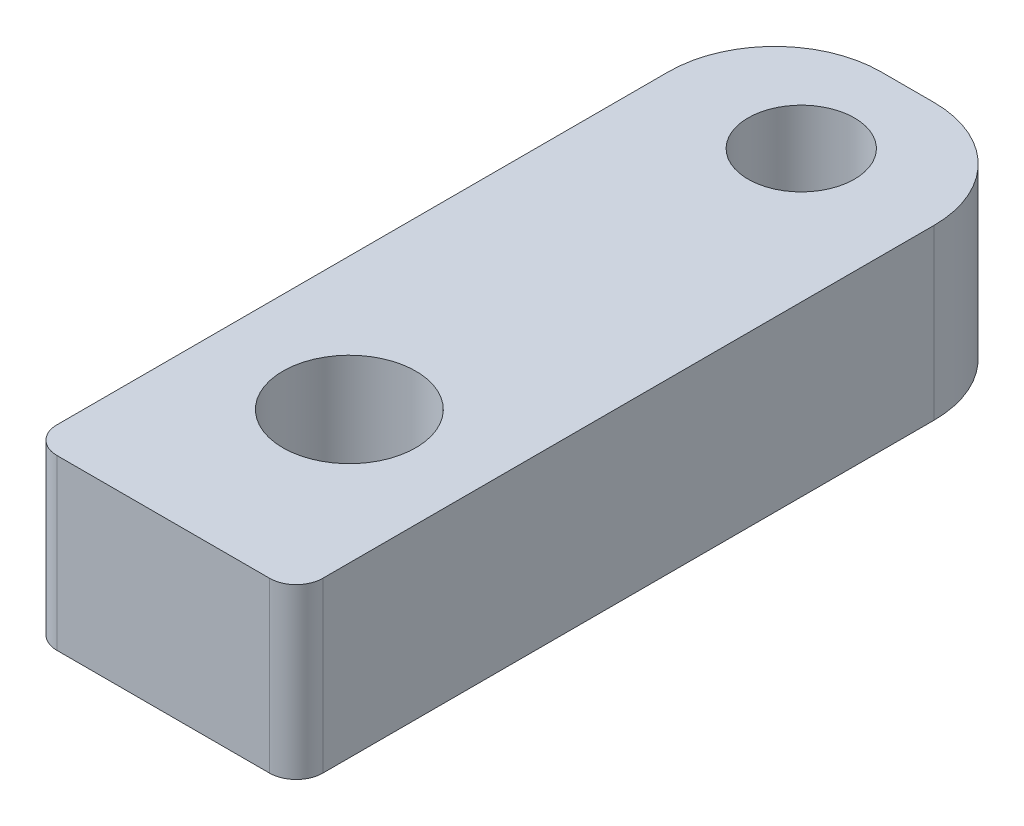
ISO-10303-21;
HEADER;
FILE_DESCRIPTION(('STEP AP214'),'2;1');
FILE_NAME('part.step','',(''),(''),'','','');
FILE_SCHEMA(('AUTOMOTIVE_DESIGN { 1 0 10303 214 1 1 1 1 }'));
ENDSEC;
DATA;
#1=APPLICATION_CONTEXT('core data for automotive mechanical design processes');
#2=APPLICATION_PROTOCOL_DEFINITION('international standard','automotive_design',2000,#1);
#3=PRODUCT_CONTEXT('',#1,'mechanical');
#4=PRODUCT('Part','Part','',(#3));
#5=PRODUCT_RELATED_PRODUCT_CATEGORY('part','',(#4));
#6=PRODUCT_DEFINITION_FORMATION('','',#4);
#7=PRODUCT_DEFINITION_CONTEXT('part definition',#1,'design');
#8=PRODUCT_DEFINITION('design','',#6,#7);
#9=PRODUCT_DEFINITION_SHAPE('','',#8);
#10=(LENGTH_UNIT() NAMED_UNIT(*) SI_UNIT(.MILLI.,.METRE.));
#11=(NAMED_UNIT(*) PLANE_ANGLE_UNIT() SI_UNIT($,.RADIAN.));
#12=(NAMED_UNIT(*) SI_UNIT($,.STERADIAN.) SOLID_ANGLE_UNIT());
#13=UNCERTAINTY_MEASURE_WITH_UNIT(LENGTH_MEASURE(1.E-05),#10,'distance_accuracy_value','');
#14=(GEOMETRIC_REPRESENTATION_CONTEXT(3) GLOBAL_UNCERTAINTY_ASSIGNED_CONTEXT((#13)) GLOBAL_UNIT_ASSIGNED_CONTEXT((#10,
#11,#12)) REPRESENTATION_CONTEXT('',''));
#15=CARTESIAN_POINT('',(0.,0.,0.));
#16=DIRECTION('',(0.,0.,1.));
#17=DIRECTION('',(1.,0.,0.));
#18=AXIS2_PLACEMENT_3D('',#15,#16,#17);
#19=CARTESIAN_POINT('',(2.5,-3.175,7.));
#20=DIRECTION('',(1.,0.,0.));
#21=DIRECTION('',(0.,0.,-1.));
#22=AXIS2_PLACEMENT_3D('',#19,#20,#21);
#23=PLANE('',#22);
#24=DIRECTION('',(0.,0.,-1.));
#25=VECTOR('',#24,1.);
#26=CARTESIAN_POINT('',(2.5,0.,7.));
#27=LINE('',#26,#25);
#28=CARTESIAN_POINT('',(2.5,0.,6.5));
#29=VERTEX_POINT('',#28);
#30=CARTESIAN_POINT('',(2.5,0.,-5.));
#31=VERTEX_POINT('',#30);
#32=EDGE_CURVE('E118',#29,#31,#27,.T.);
#33=ORIENTED_EDGE('',*,*,#32,.F.);
#34=DIRECTION('',(0.,1.,0.));
#35=VECTOR('',#34,1.);
#36=CARTESIAN_POINT('',(2.5,-3.175,6.5));
#37=LINE('',#36,#35);
#38=CARTESIAN_POINT('',(2.5,-3.175,6.5));
#39=VERTEX_POINT('',#38);
#40=EDGE_CURVE('E11',#29,#39,#37,.F.);
#41=ORIENTED_EDGE('',*,*,#40,.T.);
#42=DIRECTION('',(0.,0.,-1.));
#43=VECTOR('',#42,1.);
#44=CARTESIAN_POINT('',(2.5,-3.175,7.));
#45=LINE('',#44,#43);
#46=CARTESIAN_POINT('',(2.5,-3.175,-5.));
#47=VERTEX_POINT('',#46);
#48=EDGE_CURVE('E207',#39,#47,#45,.T.);
#49=ORIENTED_EDGE('',*,*,#48,.T.);
#50=DIRECTION('',(0.,1.,0.));
#51=VECTOR('',#50,1.);
#52=CARTESIAN_POINT('',(2.5,-3.175,-5.));
#53=LINE('',#52,#51);
#54=EDGE_CURVE('E163',#47,#31,#53,.T.);
#55=ORIENTED_EDGE('',*,*,#54,.T.);
#56=EDGE_LOOP('',(#33,#41,#49,#55));
#57=FACE_BOUND('',#56,.T.);
#58=ADVANCED_FACE('F47',(#57),#23,.T.);
#59=CARTESIAN_POINT('',(-2.5,-3.175,7.));
#60=DIRECTION('',(0.,0.,1.));
#61=DIRECTION('',(1.,0.,0.));
#62=AXIS2_PLACEMENT_3D('',#59,#60,#61);
#63=PLANE('',#62);
#64=DIRECTION('',(1.,0.,0.));
#65=VECTOR('',#64,1.);
#66=CARTESIAN_POINT('',(-2.5,0.,7.));
#67=LINE('',#66,#65);
#68=CARTESIAN_POINT('',(-2.,0.,7.));
#69=VERTEX_POINT('',#68);
#70=CARTESIAN_POINT('',(2.,0.,7.));
#71=VERTEX_POINT('',#70);
#72=EDGE_CURVE('E150',#69,#71,#67,.T.);
#73=ORIENTED_EDGE('',*,*,#72,.F.);
#74=DIRECTION('',(0.,1.,0.));
#75=VECTOR('',#74,1.);
#76=CARTESIAN_POINT('',(-2.,-3.175,7.));
#77=LINE('',#76,#75);
#78=CARTESIAN_POINT('',(-2.,-3.175,7.));
#79=VERTEX_POINT('',#78);
#80=EDGE_CURVE('E180',#69,#79,#77,.F.);
#81=ORIENTED_EDGE('',*,*,#80,.T.);
#82=DIRECTION('',(1.,0.,0.));
#83=VECTOR('',#82,1.);
#84=CARTESIAN_POINT('',(-2.5,-3.175,7.));
#85=LINE('',#84,#83);
#86=CARTESIAN_POINT('',(2.,-3.175,7.));
#87=VERTEX_POINT('',#86);
#88=EDGE_CURVE('E142',#79,#87,#85,.T.);
#89=ORIENTED_EDGE('',*,*,#88,.T.);
#90=DIRECTION('',(0.,1.,0.));
#91=VECTOR('',#90,1.);
#92=CARTESIAN_POINT('',(2.,-3.175,7.));
#93=LINE('',#92,#91);
#94=EDGE_CURVE('E176',#87,#71,#93,.T.);
#95=ORIENTED_EDGE('',*,*,#94,.T.);
#96=EDGE_LOOP('',(#73,#81,#89,#95));
#97=FACE_BOUND('',#96,.T.);
#98=ADVANCED_FACE('F204',(#97),#63,.T.);
#99=CARTESIAN_POINT('',(-2.5,-3.175,7.));
#100=DIRECTION('',(-1.,0.,0.));
#101=DIRECTION('',(0.,0.,1.));
#102=AXIS2_PLACEMENT_3D('',#99,#100,#101);
#103=PLANE('',#102);
#104=DIRECTION('',(0.,0.,1.));
#105=VECTOR('',#104,1.);
#106=CARTESIAN_POINT('',(-2.5,-3.175,7.));
#107=LINE('',#106,#105);
#108=CARTESIAN_POINT('',(-2.5,-3.175,-5.));
#109=VERTEX_POINT('',#108);
#110=CARTESIAN_POINT('',(-2.5,-3.175,6.5));
#111=VERTEX_POINT('',#110);
#112=EDGE_CURVE('E147',#109,#111,#107,.T.);
#113=ORIENTED_EDGE('',*,*,#112,.T.);
#114=DIRECTION('',(0.,1.,0.));
#115=VECTOR('',#114,1.);
#116=CARTESIAN_POINT('',(-2.5,-3.175,6.5));
#117=LINE('',#116,#115);
#118=CARTESIAN_POINT('',(-2.5,0.,6.5));
#119=VERTEX_POINT('',#118);
#120=EDGE_CURVE('E166',#111,#119,#117,.T.);
#121=ORIENTED_EDGE('',*,*,#120,.T.);
#122=DIRECTION('',(0.,0.,1.));
#123=VECTOR('',#122,1.);
#124=CARTESIAN_POINT('',(-2.5,0.,7.));
#125=LINE('',#124,#123);
#126=CARTESIAN_POINT('',(-2.5,0.,-5.));
#127=VERTEX_POINT('',#126);
#128=EDGE_CURVE('E135',#127,#119,#125,.T.);
#129=ORIENTED_EDGE('',*,*,#128,.F.);
#130=DIRECTION('',(0.,1.,0.));
#131=VECTOR('',#130,1.);
#132=CARTESIAN_POINT('',(-2.5,-3.175,-5.));
#133=LINE('',#132,#131);
#134=EDGE_CURVE('E155',#127,#109,#133,.F.);
#135=ORIENTED_EDGE('',*,*,#134,.T.);
#136=EDGE_LOOP('',(#113,#121,#129,#135));
#137=FACE_BOUND('',#136,.T.);
#138=ADVANCED_FACE('F194',(#137),#103,.T.);
#139=CARTESIAN_POINT('',(-2.5,-3.175,-7.));
#140=DIRECTION('',(0.,0.,-1.));
#141=DIRECTION('',(-1.,0.,0.));
#142=AXIS2_PLACEMENT_3D('',#139,#140,#141);
#143=PLANE('',#142);
#144=DIRECTION('',(-1.,0.,0.));
#145=VECTOR('',#144,1.);
#146=CARTESIAN_POINT('',(-2.5,-3.175,-7.));
#147=LINE('',#146,#145);
#148=CARTESIAN_POINT('',(0.5,-3.175,-7.));
#149=VERTEX_POINT('',#148);
#150=CARTESIAN_POINT('',(-0.5,-3.175,-7.));
#151=VERTEX_POINT('',#150);
#152=EDGE_CURVE('E198',#149,#151,#147,.T.);
#153=ORIENTED_EDGE('',*,*,#152,.T.);
#154=DIRECTION('',(0.,1.,0.));
#155=VECTOR('',#154,1.);
#156=CARTESIAN_POINT('',(-0.5,-3.175,-7.));
#157=LINE('',#156,#155);
#158=CARTESIAN_POINT('',(-0.5,0.,-7.));
#159=VERTEX_POINT('',#158);
#160=EDGE_CURVE('E125',#151,#159,#157,.T.);
#161=ORIENTED_EDGE('',*,*,#160,.T.);
#162=DIRECTION('',(-1.,0.,0.));
#163=VECTOR('',#162,1.);
#164=CARTESIAN_POINT('',(-2.5,0.,-7.));
#165=LINE('',#164,#163);
#166=CARTESIAN_POINT('',(0.5,0.,-7.));
#167=VERTEX_POINT('',#166);
#168=EDGE_CURVE('E117',#167,#159,#165,.T.);
#169=ORIENTED_EDGE('',*,*,#168,.F.);
#170=DIRECTION('',(0.,1.,0.));
#171=VECTOR('',#170,1.);
#172=CARTESIAN_POINT('',(0.5,-3.175,-7.));
#173=LINE('',#172,#171);
#174=EDGE_CURVE('E131',#167,#149,#173,.F.);
#175=ORIENTED_EDGE('',*,*,#174,.T.);
#176=EDGE_LOOP('',(#153,#161,#169,#175));
#177=FACE_BOUND('',#176,.T.);
#178=ADVANCED_FACE('F130',(#177),#143,.T.);
#179=CARTESIAN_POINT('',(0.,-3.175,0.));
#180=DIRECTION('',(0.,-1.,0.));
#181=DIRECTION('',(0.,0.,-1.));
#182=AXIS2_PLACEMENT_3D('',#179,#180,#181);
#183=PLANE('',#182);
#184=CARTESIAN_POINT('',(0.,-3.175,3.5));
#185=DIRECTION('',(0.,1.,0.));
#186=DIRECTION('',(0.,0.,1.));
#187=AXIS2_PLACEMENT_3D('',#184,#185,#186);
#188=CIRCLE('',#187,1.25);
#189=CARTESIAN_POINT('',(0.,-3.175,4.75));
#190=VERTEX_POINT('',#189);
#191=EDGE_CURVE('E221',#190,#190,#188,.T.);
#192=ORIENTED_EDGE('',*,*,#191,.T.);
#193=EDGE_LOOP('',(#192));
#194=FACE_BOUND('',#193,.T.);
#195=CARTESIAN_POINT('',(0.,-3.175,-5.));
#196=DIRECTION('',(0.,1.,0.));
#197=DIRECTION('',(0.,0.,-1.));
#198=AXIS2_PLACEMENT_3D('',#195,#196,#197);
#199=CIRCLE('',#198,1.);
#200=CARTESIAN_POINT('',(0.,-3.175,-6.));
#201=VERTEX_POINT('',#200);
#202=EDGE_CURVE('E213',#201,#201,#199,.T.);
#203=ORIENTED_EDGE('',*,*,#202,.T.);
#204=EDGE_LOOP('',(#203));
#205=FACE_BOUND('',#204,.T.);
#206=ORIENTED_EDGE('',*,*,#88,.F.);
#207=CARTESIAN_POINT('',(-2.,-3.175,6.5));
#208=DIRECTION('',(0.,-1.,0.));
#209=DIRECTION('',(0.,0.,-1.));
#210=AXIS2_PLACEMENT_3D('',#207,#208,#209);
#211=CIRCLE('',#210,0.5);
#212=EDGE_CURVE('E56',#79,#111,#211,.T.);
#213=ORIENTED_EDGE('',*,*,#212,.T.);
#214=ORIENTED_EDGE('',*,*,#112,.F.);
#215=CARTESIAN_POINT('',(-0.5,-3.175,-5.));
#216=DIRECTION('',(0.,-1.,0.));
#217=DIRECTION('',(0.,0.,-1.));
#218=AXIS2_PLACEMENT_3D('',#215,#216,#217);
#219=CIRCLE('',#218,2.);
#220=EDGE_CURVE('E160',#109,#151,#219,.T.);
#221=ORIENTED_EDGE('',*,*,#220,.T.);
#222=ORIENTED_EDGE('',*,*,#152,.F.);
#223=CARTESIAN_POINT('',(0.5,-3.175,-5.));
#224=DIRECTION('',(0.,-1.,0.));
#225=DIRECTION('',(0.,0.,-1.));
#226=AXIS2_PLACEMENT_3D('',#223,#224,#225);
#227=CIRCLE('',#226,2.);
#228=EDGE_CURVE('E140',#149,#47,#227,.T.);
#229=ORIENTED_EDGE('',*,*,#228,.T.);
#230=ORIENTED_EDGE('',*,*,#48,.F.);
#231=CARTESIAN_POINT('',(2.,-3.175,6.5));
#232=DIRECTION('',(0.,-1.,0.));
#233=DIRECTION('',(0.,0.,-1.));
#234=AXIS2_PLACEMENT_3D('',#231,#232,#233);
#235=CIRCLE('',#234,0.5);
#236=EDGE_CURVE('E68',#39,#87,#235,.T.);
#237=ORIENTED_EDGE('',*,*,#236,.T.);
#238=EDGE_LOOP('',(#206,#213,#214,#221,#222,#229,#230,#237));
#239=FACE_BOUND('',#238,.T.);
#240=ADVANCED_FACE('F188',(#194,#205,#239),#183,.T.);
#241=CARTESIAN_POINT('',(0.,0.,0.));
#242=DIRECTION('',(0.,-1.,0.));
#243=DIRECTION('',(0.,0.,-1.));
#244=AXIS2_PLACEMENT_3D('',#241,#242,#243);
#245=PLANE('',#244);
#246=CARTESIAN_POINT('',(0.,0.,3.5));
#247=DIRECTION('',(0.,1.,0.));
#248=DIRECTION('',(0.,0.,1.));
#249=AXIS2_PLACEMENT_3D('',#246,#247,#248);
#250=CIRCLE('',#249,1.25);
#251=CARTESIAN_POINT('',(0.,0.,4.75));
#252=VERTEX_POINT('',#251);
#253=EDGE_CURVE('E228',#252,#252,#250,.T.);
#254=ORIENTED_EDGE('',*,*,#253,.F.);
#255=EDGE_LOOP('',(#254));
#256=FACE_BOUND('',#255,.T.);
#257=CARTESIAN_POINT('',(0.,0.,-5.));
#258=DIRECTION('',(0.,1.,0.));
#259=DIRECTION('',(0.,0.,-1.));
#260=AXIS2_PLACEMENT_3D('',#257,#258,#259);
#261=CIRCLE('',#260,1.);
#262=CARTESIAN_POINT('',(0.,0.,-6.));
#263=VERTEX_POINT('',#262);
#264=EDGE_CURVE('E217',#263,#263,#261,.T.);
#265=ORIENTED_EDGE('',*,*,#264,.F.);
#266=EDGE_LOOP('',(#265));
#267=FACE_BOUND('',#266,.T.);
#268=ORIENTED_EDGE('',*,*,#128,.T.);
#269=CARTESIAN_POINT('',(-2.,0.,6.5));
#270=DIRECTION('',(0.,-1.,0.));
#271=DIRECTION('',(0.,0.,-1.));
#272=AXIS2_PLACEMENT_3D('',#269,#270,#271);
#273=CIRCLE('',#272,0.5);
#274=EDGE_CURVE('E173',#119,#69,#273,.F.);
#275=ORIENTED_EDGE('',*,*,#274,.T.);
#276=ORIENTED_EDGE('',*,*,#72,.T.);
#277=CARTESIAN_POINT('',(2.,0.,6.5));
#278=DIRECTION('',(0.,-1.,0.));
#279=DIRECTION('',(0.,0.,-1.));
#280=AXIS2_PLACEMENT_3D('',#277,#278,#279);
#281=CIRCLE('',#280,0.5);
#282=EDGE_CURVE('E170',#71,#29,#281,.F.);
#283=ORIENTED_EDGE('',*,*,#282,.T.);
#284=ORIENTED_EDGE('',*,*,#32,.T.);
#285=CARTESIAN_POINT('',(0.5,0.,-5.));
#286=DIRECTION('',(0.,-1.,0.));
#287=DIRECTION('',(0.,0.,-1.));
#288=AXIS2_PLACEMENT_3D('',#285,#286,#287);
#289=CIRCLE('',#288,2.);
#290=EDGE_CURVE('E113',#31,#167,#289,.F.);
#291=ORIENTED_EDGE('',*,*,#290,.T.);
#292=ORIENTED_EDGE('',*,*,#168,.T.);
#293=CARTESIAN_POINT('',(-0.5,0.,-5.));
#294=DIRECTION('',(0.,-1.,0.));
#295=DIRECTION('',(0.,0.,-1.));
#296=AXIS2_PLACEMENT_3D('',#293,#294,#295);
#297=CIRCLE('',#296,2.);
#298=EDGE_CURVE('E124',#159,#127,#297,.F.);
#299=ORIENTED_EDGE('',*,*,#298,.T.);
#300=EDGE_LOOP('',(#268,#275,#276,#283,#284,#291,#292,#299));
#301=FACE_BOUND('',#300,.T.);
#302=ADVANCED_FACE('F116',(#256,#267,#301),#245,.F.);
#303=CARTESIAN_POINT('',(0.,-3.175,-5.));
#304=DIRECTION('',(0.,1.,0.));
#305=DIRECTION('',(0.,0.,1.));
#306=AXIS2_PLACEMENT_3D('',#303,#304,#305);
#307=CYLINDRICAL_SURFACE('',#306,1.);
#308=ORIENTED_EDGE('',*,*,#202,.F.);
#309=EDGE_LOOP('',(#308));
#310=FACE_BOUND('',#309,.T.);
#311=ORIENTED_EDGE('',*,*,#264,.T.);
#312=EDGE_LOOP('',(#311));
#313=FACE_BOUND('',#312,.T.);
#314=ADVANCED_FACE('F237',(#310,#313),#307,.F.);
#315=CARTESIAN_POINT('',(0.,0.,3.5));
#316=DIRECTION('',(0.,1.,0.));
#317=DIRECTION('',(0.,0.,1.));
#318=AXIS2_PLACEMENT_3D('',#315,#316,#317);
#319=CYLINDRICAL_SURFACE('',#318,1.25);
#320=ORIENTED_EDGE('',*,*,#191,.F.);
#321=EDGE_LOOP('',(#320));
#322=FACE_BOUND('',#321,.T.);
#323=ORIENTED_EDGE('',*,*,#253,.T.);
#324=EDGE_LOOP('',(#323));
#325=FACE_BOUND('',#324,.T.);
#326=ADVANCED_FACE('F233',(#322,#325),#319,.F.);
#327=CARTESIAN_POINT('',(-0.5,-3.175,-5.));
#328=DIRECTION('',(0.,1.,0.));
#329=DIRECTION('',(0.,0.,1.));
#330=AXIS2_PLACEMENT_3D('',#327,#328,#329);
#331=CYLINDRICAL_SURFACE('',#330,2.);
#332=ORIENTED_EDGE('',*,*,#220,.F.);
#333=ORIENTED_EDGE('',*,*,#134,.F.);
#334=ORIENTED_EDGE('',*,*,#298,.F.);
#335=ORIENTED_EDGE('',*,*,#160,.F.);
#336=EDGE_LOOP('',(#332,#333,#334,#335));
#337=FACE_BOUND('',#336,.T.);
#338=ADVANCED_FACE('F247',(#337),#331,.T.);
#339=CARTESIAN_POINT('',(0.5,-3.175,-5.));
#340=DIRECTION('',(0.,1.,0.));
#341=DIRECTION('',(0.,0.,1.));
#342=AXIS2_PLACEMENT_3D('',#339,#340,#341);
#343=CYLINDRICAL_SURFACE('',#342,2.);
#344=ORIENTED_EDGE('',*,*,#228,.F.);
#345=ORIENTED_EDGE('',*,*,#174,.F.);
#346=ORIENTED_EDGE('',*,*,#290,.F.);
#347=ORIENTED_EDGE('',*,*,#54,.F.);
#348=EDGE_LOOP('',(#344,#345,#346,#347));
#349=FACE_BOUND('',#348,.T.);
#350=ADVANCED_FACE('F138',(#349),#343,.T.);
#351=CARTESIAN_POINT('',(-2.,-3.175,6.5));
#352=DIRECTION('',(0.,1.,0.));
#353=DIRECTION('',(0.,0.,1.));
#354=AXIS2_PLACEMENT_3D('',#351,#352,#353);
#355=CYLINDRICAL_SURFACE('',#354,0.5);
#356=ORIENTED_EDGE('',*,*,#212,.F.);
#357=ORIENTED_EDGE('',*,*,#80,.F.);
#358=ORIENTED_EDGE('',*,*,#274,.F.);
#359=ORIENTED_EDGE('',*,*,#120,.F.);
#360=EDGE_LOOP('',(#356,#357,#358,#359));
#361=FACE_BOUND('',#360,.T.);
#362=ADVANCED_FACE('F200',(#361),#355,.T.);
#363=CARTESIAN_POINT('',(2.,-3.175,6.5));
#364=DIRECTION('',(0.,1.,0.));
#365=DIRECTION('',(0.,0.,1.));
#366=AXIS2_PLACEMENT_3D('',#363,#364,#365);
#367=CYLINDRICAL_SURFACE('',#366,0.5);
#368=ORIENTED_EDGE('',*,*,#236,.F.);
#369=ORIENTED_EDGE('',*,*,#40,.F.);
#370=ORIENTED_EDGE('',*,*,#282,.F.);
#371=ORIENTED_EDGE('',*,*,#94,.F.);
#372=EDGE_LOOP('',(#368,#369,#370,#371));
#373=FACE_BOUND('',#372,.T.);
#374=ADVANCED_FACE('F49',(#373),#367,.T.);
#375=CLOSED_SHELL('',(#58,#98,#138,#178,#240,#302,#314,#326,#338,#350,#362,#374));
#376=MANIFOLD_SOLID_BREP('B2',#375);
#377=ADVANCED_BREP_SHAPE_REPRESENTATION('',(#18,#376),#14);
#378=SHAPE_DEFINITION_REPRESENTATION(#9,#377);
ENDSEC;
END-ISO-10303-21;
